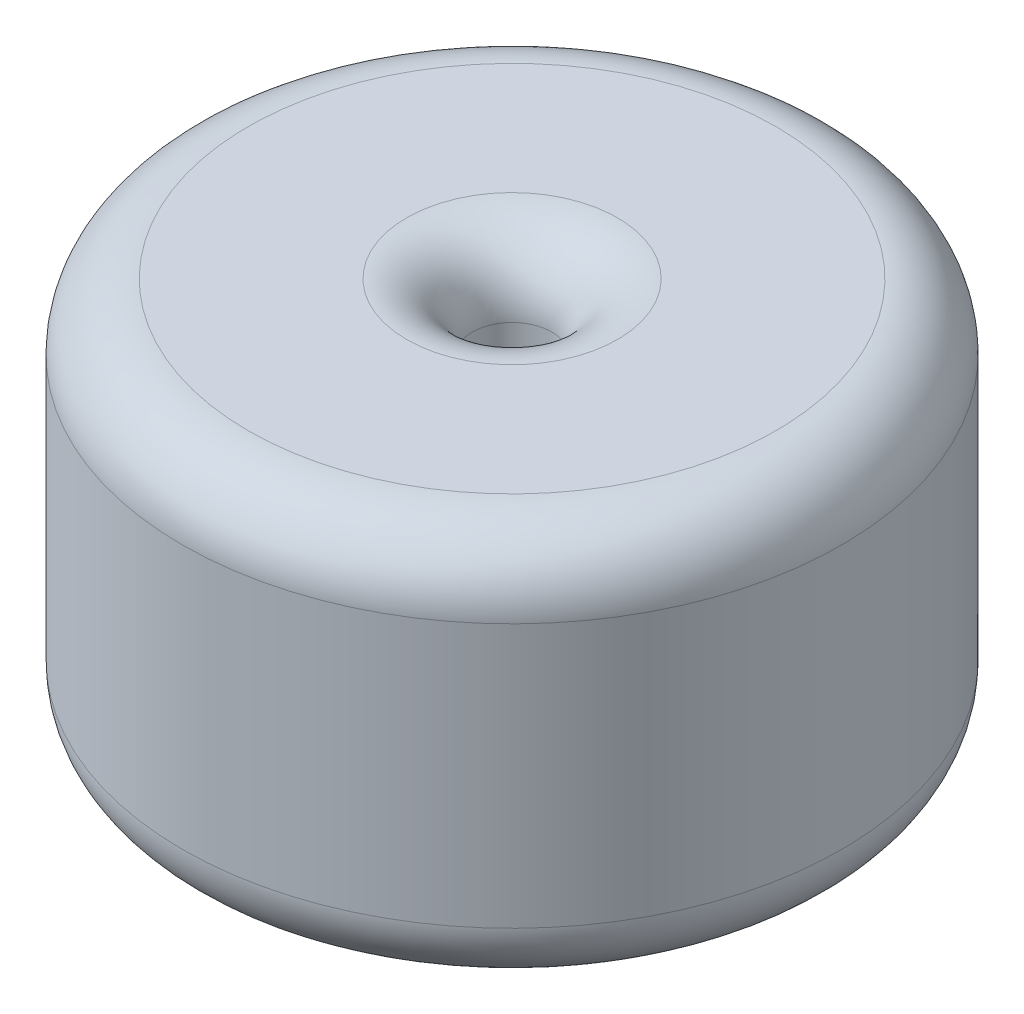
ISO-10303-21;
HEADER;
FILE_DESCRIPTION(('STEP AP214'),'2;1');
FILE_NAME('part.step','',(''),(''),'','','');
FILE_SCHEMA(('AUTOMOTIVE_DESIGN { 1 0 10303 214 1 1 1 1 }'));
ENDSEC;
DATA;
#1=APPLICATION_CONTEXT('core data for automotive mechanical design processes');
#2=APPLICATION_PROTOCOL_DEFINITION('international standard','automotive_design',2000,#1);
#3=PRODUCT_CONTEXT('',#1,'mechanical');
#4=PRODUCT('Part','Part','',(#3));
#5=PRODUCT_RELATED_PRODUCT_CATEGORY('part','',(#4));
#6=PRODUCT_DEFINITION_FORMATION('','',#4);
#7=PRODUCT_DEFINITION_CONTEXT('part definition',#1,'design');
#8=PRODUCT_DEFINITION('design','',#6,#7);
#9=PRODUCT_DEFINITION_SHAPE('','',#8);
#10=(LENGTH_UNIT() NAMED_UNIT(*) SI_UNIT(.MILLI.,.METRE.));
#11=(NAMED_UNIT(*) PLANE_ANGLE_UNIT() SI_UNIT($,.RADIAN.));
#12=(NAMED_UNIT(*) SI_UNIT($,.STERADIAN.) SOLID_ANGLE_UNIT());
#13=UNCERTAINTY_MEASURE_WITH_UNIT(LENGTH_MEASURE(1.E-05),#10,'distance_accuracy_value','');
#14=(GEOMETRIC_REPRESENTATION_CONTEXT(3) GLOBAL_UNCERTAINTY_ASSIGNED_CONTEXT((#13)) GLOBAL_UNIT_ASSIGNED_CONTEXT((#10,
#11,#12)) REPRESENTATION_CONTEXT('',''));
#15=CARTESIAN_POINT('',(0.,0.,0.));
#16=DIRECTION('',(0.,0.,1.));
#17=DIRECTION('',(1.,0.,0.));
#18=AXIS2_PLACEMENT_3D('',#15,#16,#17);
#19=CARTESIAN_POINT('',(0.,30.,0.));
#20=DIRECTION('',(0.,1.,0.));
#21=DIRECTION('',(0.,0.,1.));
#22=AXIS2_PLACEMENT_3D('',#19,#20,#21);
#23=PLANE('',#22);
#24=CARTESIAN_POINT('',(0.,30.,0.));
#25=DIRECTION('',(0.,1.,0.));
#26=DIRECTION('',(0.,0.,1.));
#27=AXIS2_PLACEMENT_3D('',#24,#25,#26);
#28=CIRCLE('',#27,20.);
#29=CARTESIAN_POINT('',(0.,30.,20.));
#30=VERTEX_POINT('',#29);
#31=EDGE_CURVE('E55',#30,#30,#28,.T.);
#32=ORIENTED_EDGE('',*,*,#31,.T.);
#33=EDGE_LOOP('',(#32));
#34=FACE_BOUND('',#33,.T.);
#35=CARTESIAN_POINT('',(0.,30.,0.));
#36=DIRECTION('',(0.,1.,0.));
#37=DIRECTION('',(0.,0.,1.));
#38=AXIS2_PLACEMENT_3D('',#35,#36,#37);
#39=CIRCLE('',#38,8.);
#40=CARTESIAN_POINT('',(0.,30.,8.));
#41=VERTEX_POINT('',#40);
#42=EDGE_CURVE('E58',#41,#41,#39,.F.);
#43=ORIENTED_EDGE('',*,*,#42,.T.);
#44=EDGE_LOOP('',(#43));
#45=FACE_BOUND('',#44,.T.);
#46=ADVANCED_FACE('F29',(#34,#45),#23,.T.);
#47=CARTESIAN_POINT('',(0.,0.,0.));
#48=DIRECTION('',(0.,1.,0.));
#49=DIRECTION('',(0.,0.,1.));
#50=AXIS2_PLACEMENT_3D('',#47,#48,#49);
#51=PLANE('',#50);
#52=CARTESIAN_POINT('',(0.,0.,0.));
#53=DIRECTION('',(0.,1.,0.));
#54=DIRECTION('',(0.,0.,1.));
#55=AXIS2_PLACEMENT_3D('',#52,#53,#54);
#56=CIRCLE('',#55,20.);
#57=CARTESIAN_POINT('',(0.,0.,20.));
#58=VERTEX_POINT('',#57);
#59=EDGE_CURVE('E10',#58,#58,#56,.F.);
#60=ORIENTED_EDGE('',*,*,#59,.T.);
#61=EDGE_LOOP('',(#60));
#62=FACE_BOUND('',#61,.T.);
#63=CARTESIAN_POINT('',(0.,0.,0.));
#64=DIRECTION('',(0.,1.,0.));
#65=DIRECTION('',(0.,0.,1.));
#66=AXIS2_PLACEMENT_3D('',#63,#64,#65);
#67=CIRCLE('',#66,8.);
#68=CARTESIAN_POINT('',(0.,0.,8.));
#69=VERTEX_POINT('',#68);
#70=EDGE_CURVE('E49',#69,#69,#67,.T.);
#71=ORIENTED_EDGE('',*,*,#70,.T.);
#72=EDGE_LOOP('',(#71));
#73=FACE_BOUND('',#72,.T.);
#74=ADVANCED_FACE('F81',(#62,#73),#51,.F.);
#75=CARTESIAN_POINT('',(0.,30.,0.));
#76=DIRECTION('',(0.,-1.,0.));
#77=DIRECTION('',(0.,0.,-1.));
#78=AXIS2_PLACEMENT_3D('',#75,#76,#77);
#79=CYLINDRICAL_SURFACE('',#78,25.);
#80=CARTESIAN_POINT('',(0.,5.,0.));
#81=DIRECTION('',(0.,1.,0.));
#82=DIRECTION('',(0.,0.,1.));
#83=AXIS2_PLACEMENT_3D('',#80,#81,#82);
#84=CIRCLE('',#83,25.);
#85=CARTESIAN_POINT('',(0.,5.,25.));
#86=VERTEX_POINT('',#85);
#87=EDGE_CURVE('E36',#86,#86,#84,.T.);
#88=ORIENTED_EDGE('',*,*,#87,.T.);
#89=EDGE_LOOP('',(#88));
#90=FACE_BOUND('',#89,.T.);
#91=CARTESIAN_POINT('',(0.,25.,0.));
#92=DIRECTION('',(0.,1.,0.));
#93=DIRECTION('',(0.,0.,1.));
#94=AXIS2_PLACEMENT_3D('',#91,#92,#93);
#95=CIRCLE('',#94,25.);
#96=CARTESIAN_POINT('',(0.,25.,25.));
#97=VERTEX_POINT('',#96);
#98=EDGE_CURVE('E52',#97,#97,#95,.F.);
#99=ORIENTED_EDGE('',*,*,#98,.T.);
#100=EDGE_LOOP('',(#99));
#101=FACE_BOUND('',#100,.T.);
#102=ADVANCED_FACE('F72',(#90,#101),#79,.T.);
#103=CARTESIAN_POINT('',(0.,30.,0.));
#104=DIRECTION('',(0.,-1.,0.));
#105=DIRECTION('',(0.,0.,-1.));
#106=AXIS2_PLACEMENT_3D('',#103,#104,#105);
#107=CYLINDRICAL_SURFACE('',#106,3.);
#108=CARTESIAN_POINT('',(0.,5.,0.));
#109=DIRECTION('',(0.,1.,0.));
#110=DIRECTION('',(0.,0.,1.));
#111=AXIS2_PLACEMENT_3D('',#108,#109,#110);
#112=CIRCLE('',#111,3.);
#113=CARTESIAN_POINT('',(0.,5.,3.));
#114=VERTEX_POINT('',#113);
#115=EDGE_CURVE('E40',#114,#114,#112,.F.);
#116=ORIENTED_EDGE('',*,*,#115,.T.);
#117=EDGE_LOOP('',(#116));
#118=FACE_BOUND('',#117,.T.);
#119=CARTESIAN_POINT('',(0.,25.,0.));
#120=DIRECTION('',(0.,1.,0.));
#121=DIRECTION('',(0.,0.,1.));
#122=AXIS2_PLACEMENT_3D('',#119,#120,#121);
#123=CIRCLE('',#122,3.);
#124=CARTESIAN_POINT('',(0.,25.,3.));
#125=VERTEX_POINT('',#124);
#126=EDGE_CURVE('E44',#125,#125,#123,.T.);
#127=ORIENTED_EDGE('',*,*,#126,.T.);
#128=EDGE_LOOP('',(#127));
#129=FACE_BOUND('',#128,.T.);
#130=ADVANCED_FACE('F69',(#118,#129),#107,.F.);
#131=CARTESIAN_POINT('',(0.,25.,0.));
#132=DIRECTION('',(0.,1.,0.));
#133=DIRECTION('',(0.,0.,1.));
#134=AXIS2_PLACEMENT_3D('',#131,#132,#133);
#135=TOROIDAL_SURFACE('',#134,20.,5.);
#136=ORIENTED_EDGE('',*,*,#98,.F.);
#137=EDGE_LOOP('',(#136));
#138=FACE_BOUND('',#137,.T.);
#139=ORIENTED_EDGE('',*,*,#31,.F.);
#140=EDGE_LOOP('',(#139));
#141=FACE_BOUND('',#140,.T.);
#142=ADVANCED_FACE('F71',(#138,#141),#135,.T.);
#143=CARTESIAN_POINT('',(0.,5.,0.));
#144=DIRECTION('',(0.,1.,0.));
#145=DIRECTION('',(0.,0.,1.));
#146=AXIS2_PLACEMENT_3D('',#143,#144,#145);
#147=TOROIDAL_SURFACE('',#146,8.,5.);
#148=ORIENTED_EDGE('',*,*,#115,.F.);
#149=EDGE_LOOP('',(#148));
#150=FACE_BOUND('',#149,.T.);
#151=ORIENTED_EDGE('',*,*,#70,.F.);
#152=EDGE_LOOP('',(#151));
#153=FACE_BOUND('',#152,.T.);
#154=ADVANCED_FACE('F66',(#150,#153),#147,.T.);
#155=CARTESIAN_POINT('',(0.,25.,0.));
#156=DIRECTION('',(0.,1.,0.));
#157=DIRECTION('',(0.,0.,1.));
#158=AXIS2_PLACEMENT_3D('',#155,#156,#157);
#159=TOROIDAL_SURFACE('',#158,8.,5.);
#160=ORIENTED_EDGE('',*,*,#42,.F.);
#161=EDGE_LOOP('',(#160));
#162=FACE_BOUND('',#161,.T.);
#163=ORIENTED_EDGE('',*,*,#126,.F.);
#164=EDGE_LOOP('',(#163));
#165=FACE_BOUND('',#164,.T.);
#166=ADVANCED_FACE('F63',(#162,#165),#159,.T.);
#167=CARTESIAN_POINT('',(0.,5.,0.));
#168=DIRECTION('',(0.,1.,0.));
#169=DIRECTION('',(0.,0.,1.));
#170=AXIS2_PLACEMENT_3D('',#167,#168,#169);
#171=TOROIDAL_SURFACE('',#170,20.,5.);
#172=ORIENTED_EDGE('',*,*,#59,.F.);
#173=EDGE_LOOP('',(#172));
#174=FACE_BOUND('',#173,.T.);
#175=ORIENTED_EDGE('',*,*,#87,.F.);
#176=EDGE_LOOP('',(#175));
#177=FACE_BOUND('',#176,.T.);
#178=ADVANCED_FACE('F31',(#174,#177),#171,.T.);
#179=CLOSED_SHELL('',(#46,#74,#102,#130,#142,#154,#166,#178));
#180=MANIFOLD_SOLID_BREP('B2',#179);
#181=ADVANCED_BREP_SHAPE_REPRESENTATION('',(#18,#180),#14);
#182=SHAPE_DEFINITION_REPRESENTATION(#9,#181);
ENDSEC;
END-ISO-10303-21;
